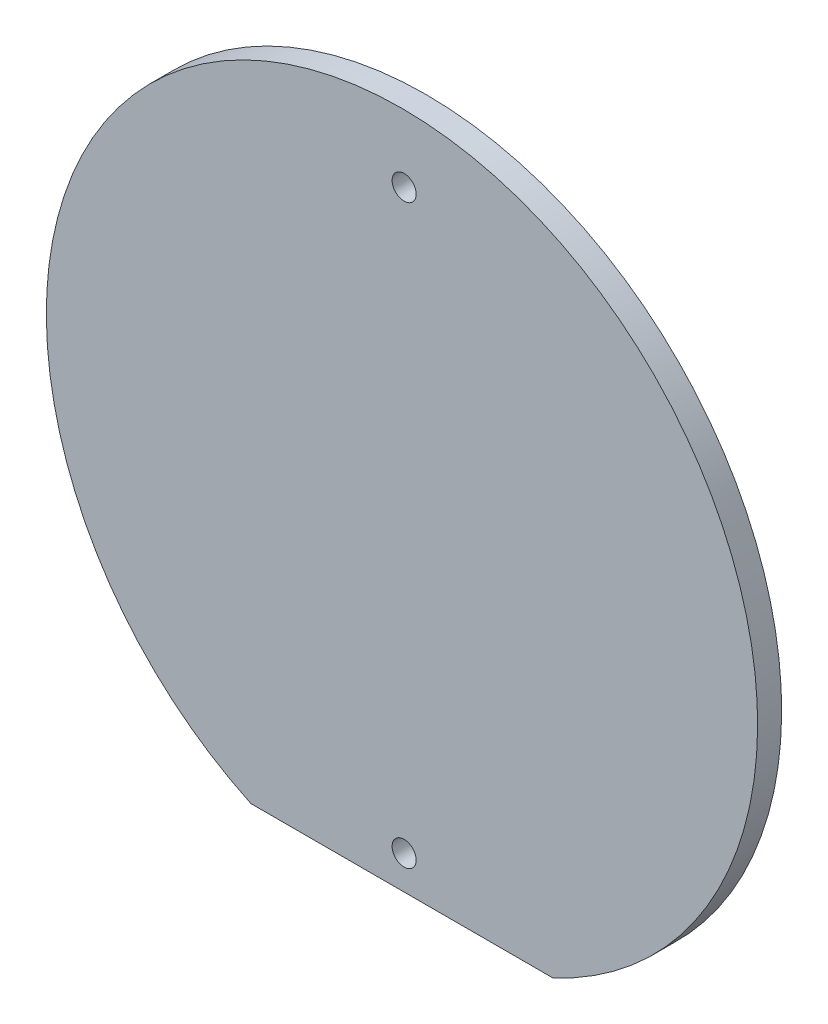
ISO-10303-21;
HEADER;
FILE_DESCRIPTION(('STEP AP214'),'2;1');
FILE_NAME('part.step','',(''),(''),'','','');
FILE_SCHEMA(('AUTOMOTIVE_DESIGN { 1 0 10303 214 1 1 1 1 }'));
ENDSEC;
DATA;
#1=APPLICATION_CONTEXT('core data for automotive mechanical design processes');
#2=APPLICATION_PROTOCOL_DEFINITION('international standard','automotive_design',2000,#1);
#3=PRODUCT_CONTEXT('',#1,'mechanical');
#4=PRODUCT('Part','Part','',(#3));
#5=PRODUCT_RELATED_PRODUCT_CATEGORY('part','',(#4));
#6=PRODUCT_DEFINITION_FORMATION('','',#4);
#7=PRODUCT_DEFINITION_CONTEXT('part definition',#1,'design');
#8=PRODUCT_DEFINITION('design','',#6,#7);
#9=PRODUCT_DEFINITION_SHAPE('','',#8);
#10=(LENGTH_UNIT() NAMED_UNIT(*) SI_UNIT(.MILLI.,.METRE.));
#11=(NAMED_UNIT(*) PLANE_ANGLE_UNIT() SI_UNIT($,.RADIAN.));
#12=(NAMED_UNIT(*) SI_UNIT($,.STERADIAN.) SOLID_ANGLE_UNIT());
#13=UNCERTAINTY_MEASURE_WITH_UNIT(LENGTH_MEASURE(1.E-05),#10,'distance_accuracy_value','');
#14=(GEOMETRIC_REPRESENTATION_CONTEXT(3) GLOBAL_UNCERTAINTY_ASSIGNED_CONTEXT((#13)) GLOBAL_UNIT_ASSIGNED_CONTEXT((#10,
#11,#12)) REPRESENTATION_CONTEXT('',''));
#15=CARTESIAN_POINT('',(0.,0.,0.));
#16=DIRECTION('',(0.,0.,1.));
#17=DIRECTION('',(1.,0.,0.));
#18=AXIS2_PLACEMENT_3D('',#15,#16,#17);
#19=CARTESIAN_POINT('',(-94.397031795319,72.5024096010838,5.));
#20=DIRECTION('',(0.,0.,-1.));
#21=DIRECTION('',(-1.,0.,0.));
#22=AXIS2_PLACEMENT_3D('',#19,#20,#21);
#23=CYLINDRICAL_SURFACE('',#22,74.);
#24=CARTESIAN_POINT('',(-94.397031795319,72.5024096010838,0.));
#25=DIRECTION('',(0.,0.,1.));
#26=DIRECTION('',(1.,0.,0.));
#27=AXIS2_PLACEMENT_3D('',#24,#25,#26);
#28=CIRCLE('',#27,74.);
#29=CARTESIAN_POINT('',(-62.980475650509,5.50240960108384,0.));
#30=VERTEX_POINT('',#29);
#31=CARTESIAN_POINT('',(-125.813587940129,5.50240960108384,0.));
#32=VERTEX_POINT('',#31);
#33=EDGE_CURVE('E68',#30,#32,#28,.T.);
#34=ORIENTED_EDGE('',*,*,#33,.T.);
#35=DIRECTION('',(0.,0.,-1.));
#36=VECTOR('',#35,1.);
#37=CARTESIAN_POINT('',(-125.813587940129,5.50240960108384,5.));
#38=LINE('',#37,#36);
#39=CARTESIAN_POINT('',(-125.813587940129,5.50240960108384,5.));
#40=VERTEX_POINT('',#39);
#41=EDGE_CURVE('E11',#40,#32,#38,.T.);
#42=ORIENTED_EDGE('',*,*,#41,.F.);
#43=CARTESIAN_POINT('',(-94.397031795319,72.5024096010838,5.));
#44=DIRECTION('',(0.,0.,1.));
#45=DIRECTION('',(1.,0.,0.));
#46=AXIS2_PLACEMENT_3D('',#43,#44,#45);
#47=CIRCLE('',#46,74.);
#48=CARTESIAN_POINT('',(-62.980475650509,5.50240960108384,5.));
#49=VERTEX_POINT('',#48);
#50=EDGE_CURVE('E67',#49,#40,#47,.T.);
#51=ORIENTED_EDGE('',*,*,#50,.F.);
#52=DIRECTION('',(0.,0.,-1.));
#53=VECTOR('',#52,1.);
#54=CARTESIAN_POINT('',(-62.980475650509,5.50240960108384,5.));
#55=LINE('',#54,#53);
#56=EDGE_CURVE('E44',#49,#30,#55,.T.);
#57=ORIENTED_EDGE('',*,*,#56,.T.);
#58=EDGE_LOOP('',(#34,#42,#51,#57));
#59=FACE_BOUND('',#58,.T.);
#60=ADVANCED_FACE('F35',(#59),#23,.T.);
#61=CARTESIAN_POINT('',(-125.813587940129,5.50240960108384,5.));
#62=DIRECTION('',(0.,1.,0.));
#63=DIRECTION('',(0.,0.,1.));
#64=AXIS2_PLACEMENT_3D('',#61,#62,#63);
#65=PLANE('',#64);
#66=DIRECTION('',(1.,0.,0.));
#67=VECTOR('',#66,1.);
#68=CARTESIAN_POINT('',(-125.813587940129,5.50240960108384,0.));
#69=LINE('',#68,#67);
#70=EDGE_CURVE('E60',#32,#30,#69,.T.);
#71=ORIENTED_EDGE('',*,*,#70,.T.);
#72=ORIENTED_EDGE('',*,*,#56,.F.);
#73=DIRECTION('',(1.,0.,0.));
#74=VECTOR('',#73,1.);
#75=CARTESIAN_POINT('',(-125.813587940129,5.50240960108384,5.));
#76=LINE('',#75,#74);
#77=EDGE_CURVE('E52',#40,#49,#76,.T.);
#78=ORIENTED_EDGE('',*,*,#77,.F.);
#79=ORIENTED_EDGE('',*,*,#41,.T.);
#80=EDGE_LOOP('',(#71,#72,#78,#79));
#81=FACE_BOUND('',#80,.T.);
#82=ADVANCED_FACE('F63',(#81),#65,.F.);
#83=CARTESIAN_POINT('',(-94.397031795319,72.5024096010838,5.));
#84=DIRECTION('',(0.,0.,1.));
#85=DIRECTION('',(1.,0.,0.));
#86=AXIS2_PLACEMENT_3D('',#83,#84,#85);
#87=PLANE('',#86);
#88=CARTESIAN_POINT('',(-93.9533952640978,132.502409601084,5.));
#89=DIRECTION('',(0.,0.,1.));
#90=DIRECTION('',(1.,0.,0.));
#91=AXIS2_PLACEMENT_3D('',#88,#89,#90);
#92=CIRCLE('',#91,2.5);
#93=CARTESIAN_POINT('',(-91.4533952640978,132.502409601084,5.));
#94=VERTEX_POINT('',#93);
#95=EDGE_CURVE('E79',#94,#94,#92,.T.);
#96=ORIENTED_EDGE('',*,*,#95,.F.);
#97=EDGE_LOOP('',(#96));
#98=FACE_BOUND('',#97,.T.);
#99=CARTESIAN_POINT('',(-93.9533952640978,12.5024096010838,5.));
#100=DIRECTION('',(0.,0.,1.));
#101=DIRECTION('',(1.,0.,0.));
#102=AXIS2_PLACEMENT_3D('',#99,#100,#101);
#103=CIRCLE('',#102,2.5);
#104=CARTESIAN_POINT('',(-91.4533952640978,12.5024096010838,5.));
#105=VERTEX_POINT('',#104);
#106=EDGE_CURVE('E83',#105,#105,#103,.T.);
#107=ORIENTED_EDGE('',*,*,#106,.F.);
#108=EDGE_LOOP('',(#107));
#109=FACE_BOUND('',#108,.T.);
#110=ORIENTED_EDGE('',*,*,#50,.T.);
#111=ORIENTED_EDGE('',*,*,#77,.T.);
#112=EDGE_LOOP('',(#110,#111));
#113=FACE_BOUND('',#112,.T.);
#114=ADVANCED_FACE('F89',(#98,#109,#113),#87,.T.);
#115=CARTESIAN_POINT('',(-94.397031795319,72.5024096010838,0.));
#116=DIRECTION('',(0.,0.,1.));
#117=DIRECTION('',(1.,0.,0.));
#118=AXIS2_PLACEMENT_3D('',#115,#116,#117);
#119=PLANE('',#118);
#120=CARTESIAN_POINT('',(-93.9533952640978,132.502409601084,0.));
#121=DIRECTION('',(0.,0.,1.));
#122=DIRECTION('',(1.,0.,0.));
#123=AXIS2_PLACEMENT_3D('',#120,#121,#122);
#124=CIRCLE('',#123,2.5);
#125=CARTESIAN_POINT('',(-91.4533952640978,132.502409601084,0.));
#126=VERTEX_POINT('',#125);
#127=EDGE_CURVE('E38',#126,#126,#124,.T.);
#128=ORIENTED_EDGE('',*,*,#127,.T.);
#129=EDGE_LOOP('',(#128));
#130=FACE_BOUND('',#129,.T.);
#131=CARTESIAN_POINT('',(-93.9533952640978,12.5024096010838,0.));
#132=DIRECTION('',(0.,0.,1.));
#133=DIRECTION('',(1.,0.,0.));
#134=AXIS2_PLACEMENT_3D('',#131,#132,#133);
#135=CIRCLE('',#134,2.5);
#136=CARTESIAN_POINT('',(-91.4533952640978,12.5024096010838,0.));
#137=VERTEX_POINT('',#136);
#138=EDGE_CURVE('E75',#137,#137,#135,.T.);
#139=ORIENTED_EDGE('',*,*,#138,.T.);
#140=EDGE_LOOP('',(#139));
#141=FACE_BOUND('',#140,.T.);
#142=ORIENTED_EDGE('',*,*,#33,.F.);
#143=ORIENTED_EDGE('',*,*,#70,.F.);
#144=EDGE_LOOP('',(#142,#143));
#145=FACE_BOUND('',#144,.T.);
#146=ADVANCED_FACE('F72',(#130,#141,#145),#119,.F.);
#147=CARTESIAN_POINT('',(-93.9533952640978,12.5024096010838,-5.));
#148=DIRECTION('',(0.,0.,1.));
#149=DIRECTION('',(1.,0.,0.));
#150=AXIS2_PLACEMENT_3D('',#147,#148,#149);
#151=CYLINDRICAL_SURFACE('',#150,2.5);
#152=ORIENTED_EDGE('',*,*,#106,.T.);
#153=EDGE_LOOP('',(#152));
#154=FACE_BOUND('',#153,.T.);
#155=ORIENTED_EDGE('',*,*,#138,.F.);
#156=EDGE_LOOP('',(#155));
#157=FACE_BOUND('',#156,.T.);
#158=ADVANCED_FACE('F97',(#154,#157),#151,.F.);
#159=CARTESIAN_POINT('',(-93.9533952640978,132.502409601084,-5.));
#160=DIRECTION('',(0.,0.,1.));
#161=DIRECTION('',(1.,0.,0.));
#162=AXIS2_PLACEMENT_3D('',#159,#160,#161);
#163=CYLINDRICAL_SURFACE('',#162,2.5);
#164=ORIENTED_EDGE('',*,*,#95,.T.);
#165=EDGE_LOOP('',(#164));
#166=FACE_BOUND('',#165,.T.);
#167=ORIENTED_EDGE('',*,*,#127,.F.);
#168=EDGE_LOOP('',(#167));
#169=FACE_BOUND('',#168,.T.);
#170=ADVANCED_FACE('F128',(#166,#169),#163,.F.);
#171=CLOSED_SHELL('',(#60,#82,#114,#146,#158,#170));
#172=MANIFOLD_SOLID_BREP('B2',#171);
#173=ADVANCED_BREP_SHAPE_REPRESENTATION('',(#18,#172),#14);
#174=SHAPE_DEFINITION_REPRESENTATION(#9,#173);
ENDSEC;
END-ISO-10303-21;
